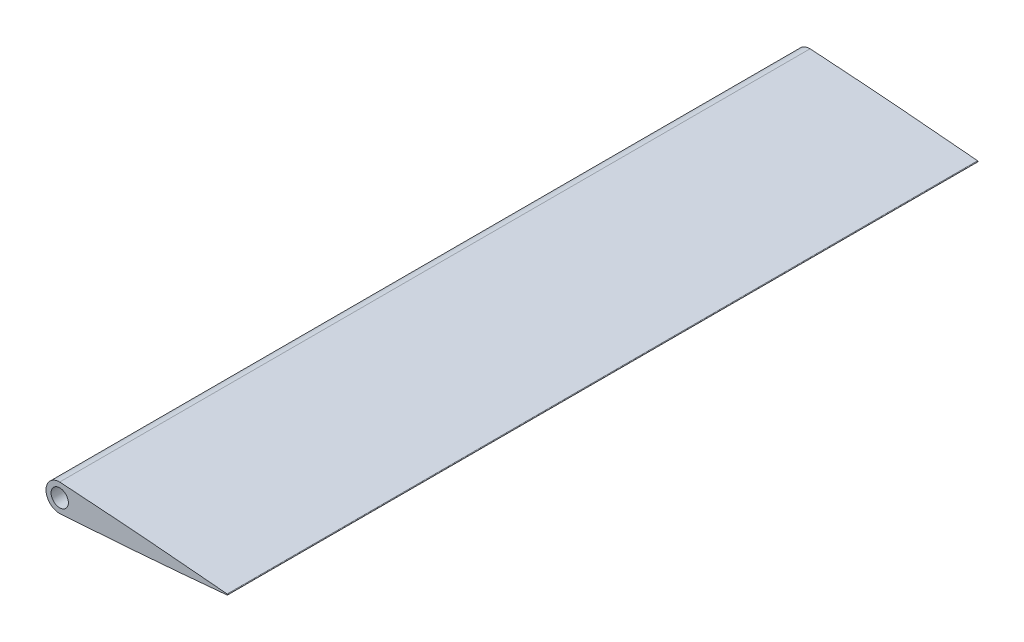
ISO-10303-21;
HEADER;
FILE_DESCRIPTION(('STEP AP214'),'2;1');
FILE_NAME('part.step','',(''),(''),'','','');
FILE_SCHEMA(('AUTOMOTIVE_DESIGN { 1 0 10303 214 1 1 1 1 }'));
ENDSEC;
DATA;
#1=APPLICATION_CONTEXT('core data for automotive mechanical design processes');
#2=APPLICATION_PROTOCOL_DEFINITION('international standard','automotive_design',2000,#1);
#3=PRODUCT_CONTEXT('',#1,'mechanical');
#4=PRODUCT('Part','Part','',(#3));
#5=PRODUCT_RELATED_PRODUCT_CATEGORY('part','',(#4));
#6=PRODUCT_DEFINITION_FORMATION('','',#4);
#7=PRODUCT_DEFINITION_CONTEXT('part definition',#1,'design');
#8=PRODUCT_DEFINITION('design','',#6,#7);
#9=PRODUCT_DEFINITION_SHAPE('','',#8);
#10=(LENGTH_UNIT() NAMED_UNIT(*) SI_UNIT(.MILLI.,.METRE.));
#11=(NAMED_UNIT(*) PLANE_ANGLE_UNIT() SI_UNIT($,.RADIAN.));
#12=(NAMED_UNIT(*) SI_UNIT($,.STERADIAN.) SOLID_ANGLE_UNIT());
#13=UNCERTAINTY_MEASURE_WITH_UNIT(LENGTH_MEASURE(1.E-05),#10,'distance_accuracy_value','');
#14=(GEOMETRIC_REPRESENTATION_CONTEXT(3) GLOBAL_UNCERTAINTY_ASSIGNED_CONTEXT((#13)) GLOBAL_UNIT_ASSIGNED_CONTEXT((#10,
#11,#12)) REPRESENTATION_CONTEXT('',''));
#15=CARTESIAN_POINT('',(0.,0.,0.));
#16=DIRECTION('',(0.,0.,1.));
#17=DIRECTION('',(1.,0.,0.));
#18=AXIS2_PLACEMENT_3D('',#15,#16,#17);
#19=CARTESIAN_POINT('',(99.9999999999999,0.083999999999844,130.));
#20=CARTESIAN_POINT('',(98.3334888149329,0.236746480055217,130.));
#21=CARTESIAN_POINT('',(95.0011947254254,0.542172688557477,130.));
#22=CARTESIAN_POINT('',(88.3355596211878,1.11089898015653,130.));
#23=CARTESIAN_POINT('',(80.3363209292675,1.73752312291176,130.));
#24=CARTESIAN_POINT('',(74.0008291056189,2.18017191091439,130.));
#25=CARTESIAN_POINT('',(71.,2.37764507814051,130.));
#26=B_SPLINE_CURVE_WITH_KNOTS('',3,(#19,#20,#21,#22,#23,#24,#25),.UNSPECIFIED.,.F.,.F.,(4,1,1,1,
4),(0.,0.0248762929189861,0.0497417146704998,0.0994434021110951,0.144146709335921),.UNSPECIFIED.);
#27=DIRECTION('',(0.,0.,-1.));
#28=VECTOR('',#27,1.);
#29=SURFACE_OF_LINEAR_EXTRUSION('',#26,#28);
#30=CARTESIAN_POINT('',(99.9999999999999,0.083999999999844,0.));
#31=CARTESIAN_POINT('',(98.3334888149329,0.236746480055217,0.));
#32=CARTESIAN_POINT('',(95.0011947254254,0.542172688557477,0.));
#33=CARTESIAN_POINT('',(88.3355596211878,1.11089898015653,0.));
#34=CARTESIAN_POINT('',(80.3363209292675,1.73752312291176,0.));
#35=CARTESIAN_POINT('',(74.0008291056189,2.18017191091439,0.));
#36=CARTESIAN_POINT('',(71.,2.37764507814051,0.));
#37=B_SPLINE_CURVE_WITH_KNOTS('',3,(#30,#31,#32,#33,#34,#35,#36),.UNSPECIFIED.,.F.,.F.,(4,1,1,1,
4),(0.,0.0248762929189861,0.0497417146704998,0.0994434021110951,0.144146709335921),.UNSPECIFIED.);
#38=CARTESIAN_POINT('',(100.,0.0839999999615596,0.));
#39=VERTEX_POINT('',#38);
#40=CARTESIAN_POINT('',(71.,2.37764507814011,0.));
#41=VERTEX_POINT('',#40);
#42=EDGE_CURVE('E115',#39,#41,#37,.T.);
#43=ORIENTED_EDGE('',*,*,#42,.T.);
#44=DIRECTION('',(0.,0.,-1.));
#45=VECTOR('',#44,1.);
#46=CARTESIAN_POINT('',(71.,2.37764507814011,130.));
#47=LINE('',#46,#45);
#48=CARTESIAN_POINT('',(71.,2.37764507814011,130.));
#49=VERTEX_POINT('',#48);
#50=EDGE_CURVE('E11',#49,#41,#47,.T.);
#51=ORIENTED_EDGE('',*,*,#50,.F.);
#52=CARTESIAN_POINT('',(100.,0.0839999999615596,130.));
#53=VERTEX_POINT('',#52);
#54=EDGE_CURVE('E84',#53,#49,#26,.T.);
#55=ORIENTED_EDGE('',*,*,#54,.F.);
#56=DIRECTION('',(0.,0.,-1.));
#57=VECTOR('',#56,1.);
#58=CARTESIAN_POINT('',(100.,0.0839999999615596,130.));
#59=LINE('',#58,#57);
#60=EDGE_CURVE('E92',#53,#39,#59,.T.);
#61=ORIENTED_EDGE('',*,*,#60,.T.);
#62=EDGE_LOOP('',(#43,#51,#55,#61));
#63=FACE_BOUND('',#62,.T.);
#64=ADVANCED_FACE('F32',(#63),#29,.F.);
#65=CARTESIAN_POINT('',(70.999999999994,-3.97251675998689E-13,130.));
#66=DIRECTION('',(0.,0.,-1.));
#67=DIRECTION('',(-1.,0.,0.));
#68=AXIS2_PLACEMENT_3D('',#65,#66,#67);
#69=CYLINDRICAL_SURFACE('',#68,2.37764507814051);
#70=CARTESIAN_POINT('',(70.999999999994,-3.97251675998689E-13,0.));
#71=DIRECTION('',(0.,0.,1.));
#72=DIRECTION('',(1.,0.,0.));
#73=AXIS2_PLACEMENT_3D('',#70,#71,#72);
#74=CIRCLE('',#73,2.37764507814051);
#75=CARTESIAN_POINT('',(70.9999999999999,-2.37764507814052,0.));
#76=VERTEX_POINT('',#75);
#77=EDGE_CURVE('E88',#41,#76,#74,.T.);
#78=ORIENTED_EDGE('',*,*,#77,.T.);
#79=DIRECTION('',(0.,0.,-1.));
#80=VECTOR('',#79,1.);
#81=CARTESIAN_POINT('',(70.9999999999999,-2.37764507814052,130.));
#82=LINE('',#81,#80);
#83=CARTESIAN_POINT('',(70.9999999999999,-2.37764507814052,130.));
#84=VERTEX_POINT('',#83);
#85=EDGE_CURVE('E41',#84,#76,#82,.T.);
#86=ORIENTED_EDGE('',*,*,#85,.F.);
#87=CARTESIAN_POINT('',(70.999999999994,-3.97251675998689E-13,130.));
#88=DIRECTION('',(0.,0.,1.));
#89=DIRECTION('',(1.,0.,0.));
#90=AXIS2_PLACEMENT_3D('',#87,#88,#89);
#91=CIRCLE('',#90,2.37764507814051);
#92=EDGE_CURVE('E79',#49,#84,#91,.T.);
#93=ORIENTED_EDGE('',*,*,#92,.F.);
#94=ORIENTED_EDGE('',*,*,#50,.T.);
#95=EDGE_LOOP('',(#78,#86,#93,#94));
#96=FACE_BOUND('',#95,.T.);
#97=ADVANCED_FACE('F87',(#96),#69,.T.);
#98=CARTESIAN_POINT('',(70.9999999999999,-2.37764507814052,130.));
#99=CARTESIAN_POINT('',(74.0008291056204,-2.18017191090651,130.));
#100=CARTESIAN_POINT('',(80.3363209292699,-1.73752312288736,130.));
#101=CARTESIAN_POINT('',(88.3355596211905,-1.11089898011125,130.));
#102=CARTESIAN_POINT('',(95.0011947254267,-0.542172688494941,130.));
#103=CARTESIAN_POINT('',(98.3334888149335,-0.236746479984054,130.));
#104=CARTESIAN_POINT('',(100.,-0.083999999924366,130.));
#105=B_SPLINE_CURVE_WITH_KNOTS('',3,(#98,#99,#100,#101,#102,#103,#104),.UNSPECIFIED.,.F.,.F.,(4,
1,1,1,4),(0.855853290664048,0.900556597888905,0.9502582853295,0.975123707081014,1.),.UNSPECIFIED.);
#106=DIRECTION('',(0.,0.,-1.));
#107=VECTOR('',#106,1.);
#108=SURFACE_OF_LINEAR_EXTRUSION('',#105,#107);
#109=CARTESIAN_POINT('',(70.9999999999999,-2.37764507814052,0.));
#110=CARTESIAN_POINT('',(74.0008291056204,-2.18017191090651,0.));
#111=CARTESIAN_POINT('',(80.3363209292699,-1.73752312288736,0.));
#112=CARTESIAN_POINT('',(88.3355596211905,-1.11089898011125,0.));
#113=CARTESIAN_POINT('',(95.0011947254267,-0.542172688494941,0.));
#114=CARTESIAN_POINT('',(98.3334888149335,-0.236746479984054,0.));
#115=CARTESIAN_POINT('',(100.,-0.083999999924366,0.));
#116=B_SPLINE_CURVE_WITH_KNOTS('',3,(#109,#110,#111,#112,#113,#114,#115),.UNSPECIFIED.,.F.,.F.,
(4,1,1,1,4),(0.855853290664048,0.900556597888905,0.9502582853295,0.975123707081014,1.),.UNSPECIFIED.);
#117=CARTESIAN_POINT('',(100.,-0.083999999961606,0.));
#118=VERTEX_POINT('',#117);
#119=EDGE_CURVE('E66',#76,#118,#116,.T.);
#120=ORIENTED_EDGE('',*,*,#119,.T.);
#121=DIRECTION('',(0.,0.,-1.));
#122=VECTOR('',#121,1.);
#123=CARTESIAN_POINT('',(100.,-0.083999999961606,130.));
#124=LINE('',#123,#122);
#125=CARTESIAN_POINT('',(100.,-0.083999999961606,130.));
#126=VERTEX_POINT('',#125);
#127=EDGE_CURVE('E89',#126,#118,#124,.T.);
#128=ORIENTED_EDGE('',*,*,#127,.F.);
#129=EDGE_CURVE('E82',#84,#126,#105,.T.);
#130=ORIENTED_EDGE('',*,*,#129,.F.);
#131=ORIENTED_EDGE('',*,*,#85,.T.);
#132=EDGE_LOOP('',(#120,#128,#130,#131));
#133=FACE_BOUND('',#132,.T.);
#134=ADVANCED_FACE('F90',(#133),#108,.F.);
#135=CARTESIAN_POINT('',(99.999999999994,0.,130.));
#136=DIRECTION('',(0.,0.,-1.));
#137=DIRECTION('',(-1.,0.,0.));
#138=AXIS2_PLACEMENT_3D('',#135,#136,#137);
#139=CYLINDRICAL_SURFACE('',#138,0.0839999999615827);
#140=CARTESIAN_POINT('',(99.999999999994,0.,0.));
#141=DIRECTION('',(0.,0.,1.));
#142=DIRECTION('',(-1.,0.,0.));
#143=AXIS2_PLACEMENT_3D('',#140,#141,#142);
#144=CIRCLE('',#143,0.0839999999615827);
#145=EDGE_CURVE('E72',#118,#39,#144,.T.);
#146=ORIENTED_EDGE('',*,*,#145,.T.);
#147=ORIENTED_EDGE('',*,*,#60,.F.);
#148=CARTESIAN_POINT('',(99.999999999994,0.,130.));
#149=DIRECTION('',(0.,0.,1.));
#150=DIRECTION('',(-1.,0.,0.));
#151=AXIS2_PLACEMENT_3D('',#148,#149,#150);
#152=CIRCLE('',#151,0.0839999999615827);
#153=EDGE_CURVE('E49',#126,#53,#152,.T.);
#154=ORIENTED_EDGE('',*,*,#153,.F.);
#155=ORIENTED_EDGE('',*,*,#127,.T.);
#156=EDGE_LOOP('',(#146,#147,#154,#155));
#157=FACE_BOUND('',#156,.T.);
#158=ADVANCED_FACE('F104',(#157),#139,.T.);
#159=CARTESIAN_POINT('',(85.5077466892461,1.32847743626813,130.));
#160=DIRECTION('',(0.,0.,-1.));
#161=DIRECTION('',(-1.,0.,0.));
#162=AXIS2_PLACEMENT_3D('',#159,#160,#161);
#163=PLANE('',#162);
#164=CARTESIAN_POINT('',(71.,0.,130.));
#165=DIRECTION('',(0.,0.,-1.));
#166=DIRECTION('',(-1.,0.,0.));
#167=AXIS2_PLACEMENT_3D('',#164,#165,#166);
#168=CIRCLE('',#167,1.5);
#169=CARTESIAN_POINT('',(69.5,0.,130.));
#170=VERTEX_POINT('',#169);
#171=EDGE_CURVE('E117',#170,#170,#168,.T.);
#172=ORIENTED_EDGE('',*,*,#171,.T.);
#173=EDGE_LOOP('',(#172));
#174=FACE_BOUND('',#173,.T.);
#175=ORIENTED_EDGE('',*,*,#54,.T.);
#176=ORIENTED_EDGE('',*,*,#92,.T.);
#177=ORIENTED_EDGE('',*,*,#129,.T.);
#178=ORIENTED_EDGE('',*,*,#153,.T.);
#179=EDGE_LOOP('',(#175,#176,#177,#178));
#180=FACE_BOUND('',#179,.T.);
#181=ADVANCED_FACE('F80',(#174,#180),#163,.F.);
#182=CARTESIAN_POINT('',(85.5077466892461,1.32847743626813,0.));
#183=DIRECTION('',(0.,0.,-1.));
#184=DIRECTION('',(-1.,0.,0.));
#185=AXIS2_PLACEMENT_3D('',#182,#183,#184);
#186=PLANE('',#185);
#187=CARTESIAN_POINT('',(71.,0.,0.));
#188=DIRECTION('',(0.,0.,-1.));
#189=DIRECTION('',(-1.,0.,0.));
#190=AXIS2_PLACEMENT_3D('',#187,#188,#189);
#191=CIRCLE('',#190,1.5);
#192=CARTESIAN_POINT('',(69.5,0.,0.));
#193=VERTEX_POINT('',#192);
#194=EDGE_CURVE('E120',#193,#193,#191,.T.);
#195=ORIENTED_EDGE('',*,*,#194,.F.);
#196=EDGE_LOOP('',(#195));
#197=FACE_BOUND('',#196,.T.);
#198=ORIENTED_EDGE('',*,*,#42,.F.);
#199=ORIENTED_EDGE('',*,*,#145,.F.);
#200=ORIENTED_EDGE('',*,*,#119,.F.);
#201=ORIENTED_EDGE('',*,*,#77,.F.);
#202=EDGE_LOOP('',(#198,#199,#200,#201));
#203=FACE_BOUND('',#202,.T.);
#204=ADVANCED_FACE('F136',(#197,#203),#186,.T.);
#205=CARTESIAN_POINT('',(71.,0.,130.));
#206=DIRECTION('',(0.,0.,-1.));
#207=DIRECTION('',(-1.,0.,0.));
#208=AXIS2_PLACEMENT_3D('',#205,#206,#207);
#209=CYLINDRICAL_SURFACE('',#208,1.5);
#210=ORIENTED_EDGE('',*,*,#171,.F.);
#211=EDGE_LOOP('',(#210));
#212=FACE_BOUND('',#211,.T.);
#213=ORIENTED_EDGE('',*,*,#194,.T.);
#214=EDGE_LOOP('',(#213));
#215=FACE_BOUND('',#214,.T.);
#216=ADVANCED_FACE('F138',(#212,#215),#209,.F.);
#217=CLOSED_SHELL('',(#64,#97,#134,#158,#181,#204,#216));
#218=MANIFOLD_SOLID_BREP('B2',#217);
#219=ADVANCED_BREP_SHAPE_REPRESENTATION('',(#18,#218),#14);
#220=SHAPE_DEFINITION_REPRESENTATION(#9,#219);
ENDSEC;
END-ISO-10303-21;
